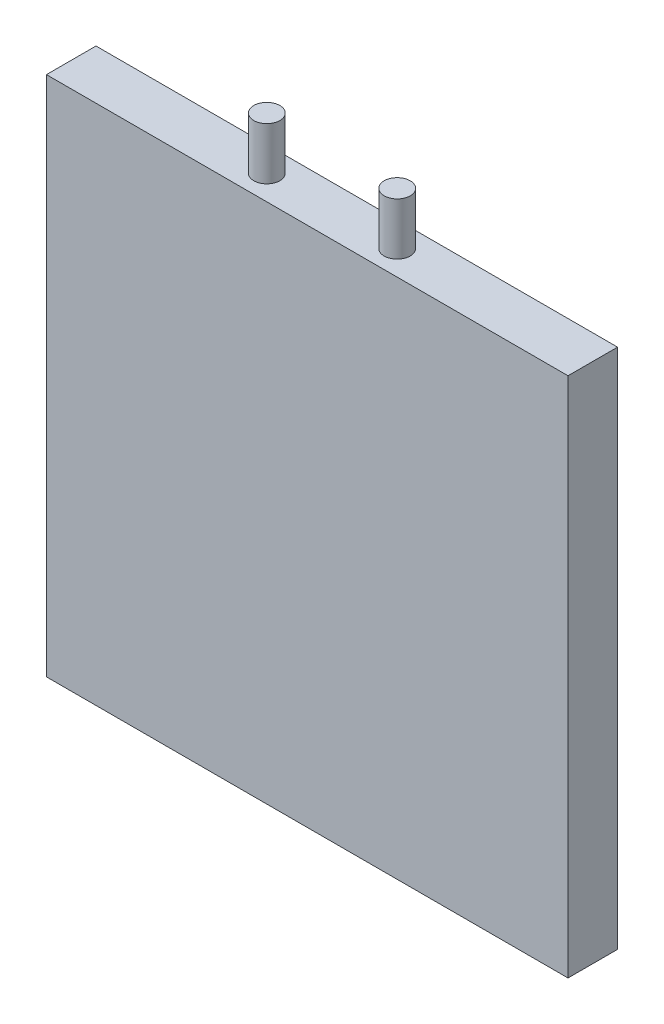
ISO-10303-21;
HEADER;
FILE_DESCRIPTION(('STEP AP214'),'2;1');
FILE_NAME('part.step','',(''),(''),'','','');
FILE_SCHEMA(('AUTOMOTIVE_DESIGN { 1 0 10303 214 1 1 1 1 }'));
ENDSEC;
DATA;
#1=APPLICATION_CONTEXT('core data for automotive mechanical design processes');
#2=APPLICATION_PROTOCOL_DEFINITION('international standard','automotive_design',2000,#1);
#3=PRODUCT_CONTEXT('',#1,'mechanical');
#4=PRODUCT('Part','Part','',(#3));
#5=PRODUCT_RELATED_PRODUCT_CATEGORY('part','',(#4));
#6=PRODUCT_DEFINITION_FORMATION('','',#4);
#7=PRODUCT_DEFINITION_CONTEXT('part definition',#1,'design');
#8=PRODUCT_DEFINITION('design','',#6,#7);
#9=PRODUCT_DEFINITION_SHAPE('','',#8);
#10=(LENGTH_UNIT() NAMED_UNIT(*) SI_UNIT(.MILLI.,.METRE.));
#11=(NAMED_UNIT(*) PLANE_ANGLE_UNIT() SI_UNIT($,.RADIAN.));
#12=(NAMED_UNIT(*) SI_UNIT($,.STERADIAN.) SOLID_ANGLE_UNIT());
#13=UNCERTAINTY_MEASURE_WITH_UNIT(LENGTH_MEASURE(1.E-05),#10,'distance_accuracy_value','');
#14=(GEOMETRIC_REPRESENTATION_CONTEXT(3) GLOBAL_UNCERTAINTY_ASSIGNED_CONTEXT((#13)) GLOBAL_UNIT_ASSIGNED_CONTEXT((#10,
#11,#12)) REPRESENTATION_CONTEXT('',''));
#15=CARTESIAN_POINT('',(0.,0.,0.));
#16=DIRECTION('',(0.,0.,1.));
#17=DIRECTION('',(1.,0.,0.));
#18=AXIS2_PLACEMENT_3D('',#15,#16,#17);
#19=CARTESIAN_POINT('',(-20.,20.,3.8));
#20=DIRECTION('',(0.,-1.,0.));
#21=DIRECTION('',(0.,0.,-1.));
#22=AXIS2_PLACEMENT_3D('',#19,#20,#21);
#23=PLANE('',#22);
#24=CARTESIAN_POINT('',(5.,20.,1.9));
#25=DIRECTION('',(0.,-1.,0.));
#26=DIRECTION('',(0.,0.,-1.));
#27=AXIS2_PLACEMENT_3D('',#24,#25,#26);
#28=CIRCLE('',#27,1.);
#29=CARTESIAN_POINT('',(5.,20.,0.899999999999998));
#30=VERTEX_POINT('',#29);
#31=EDGE_CURVE('E46',#30,#30,#28,.F.);
#32=ORIENTED_EDGE('',*,*,#31,.F.);
#33=EDGE_LOOP('',(#32));
#34=FACE_BOUND('',#33,.T.);
#35=DIRECTION('',(-1.,0.,0.));
#36=VECTOR('',#35,1.);
#37=CARTESIAN_POINT('',(-20.,20.,0.));
#38=LINE('',#37,#36);
#39=CARTESIAN_POINT('',(20.,20.,0.));
#40=VERTEX_POINT('',#39);
#41=CARTESIAN_POINT('',(-20.,20.,0.));
#42=VERTEX_POINT('',#41);
#43=EDGE_CURVE('E95',#40,#42,#38,.T.);
#44=ORIENTED_EDGE('',*,*,#43,.T.);
#45=DIRECTION('',(0.,0.,-1.));
#46=VECTOR('',#45,1.);
#47=CARTESIAN_POINT('',(-20.,20.,3.8));
#48=LINE('',#47,#46);
#49=CARTESIAN_POINT('',(-20.,20.,3.8));
#50=VERTEX_POINT('',#49);
#51=EDGE_CURVE('E93',#50,#42,#48,.T.);
#52=ORIENTED_EDGE('',*,*,#51,.F.);
#53=DIRECTION('',(-1.,0.,0.));
#54=VECTOR('',#53,1.);
#55=CARTESIAN_POINT('',(-20.,20.,3.8));
#56=LINE('',#55,#54);
#57=CARTESIAN_POINT('',(20.,20.,3.8));
#58=VERTEX_POINT('',#57);
#59=EDGE_CURVE('E85',#58,#50,#56,.T.);
#60=ORIENTED_EDGE('',*,*,#59,.F.);
#61=DIRECTION('',(0.,0.,-1.));
#62=VECTOR('',#61,1.);
#63=CARTESIAN_POINT('',(20.,20.,3.8));
#64=LINE('',#63,#62);
#65=EDGE_CURVE('E96',#58,#40,#64,.T.);
#66=ORIENTED_EDGE('',*,*,#65,.T.);
#67=EDGE_LOOP('',(#44,#52,#60,#66));
#68=FACE_BOUND('',#67,.T.);
#69=CARTESIAN_POINT('',(-5.,20.,1.9));
#70=DIRECTION('',(0.,-1.,0.));
#71=DIRECTION('',(0.,0.,-1.));
#72=AXIS2_PLACEMENT_3D('',#69,#70,#71);
#73=CIRCLE('',#72,1.);
#74=CARTESIAN_POINT('',(-5.,20.,0.899999999999998));
#75=VERTEX_POINT('',#74);
#76=EDGE_CURVE('E11',#75,#75,#73,.F.);
#77=ORIENTED_EDGE('',*,*,#76,.F.);
#78=EDGE_LOOP('',(#77));
#79=FACE_BOUND('',#78,.T.);
#80=ADVANCED_FACE('F37',(#34,#68,#79),#23,.F.);
#81=CARTESIAN_POINT('',(20.,20.,3.8));
#82=DIRECTION('',(-1.,0.,0.));
#83=DIRECTION('',(0.,-1.,0.));
#84=AXIS2_PLACEMENT_3D('',#81,#82,#83);
#85=PLANE('',#84);
#86=DIRECTION('',(0.,1.,0.));
#87=VECTOR('',#86,1.);
#88=CARTESIAN_POINT('',(20.,20.,0.));
#89=LINE('',#88,#87);
#90=CARTESIAN_POINT('',(20.,-20.,0.));
#91=VERTEX_POINT('',#90);
#92=EDGE_CURVE('E105',#91,#40,#89,.T.);
#93=ORIENTED_EDGE('',*,*,#92,.T.);
#94=ORIENTED_EDGE('',*,*,#65,.F.);
#95=DIRECTION('',(0.,1.,0.));
#96=VECTOR('',#95,1.);
#97=CARTESIAN_POINT('',(20.,20.,3.8));
#98=LINE('',#97,#96);
#99=CARTESIAN_POINT('',(20.,-20.,3.8));
#100=VERTEX_POINT('',#99);
#101=EDGE_CURVE('E90',#100,#58,#98,.T.);
#102=ORIENTED_EDGE('',*,*,#101,.F.);
#103=DIRECTION('',(0.,0.,-1.));
#104=VECTOR('',#103,1.);
#105=CARTESIAN_POINT('',(20.,-20.,3.8));
#106=LINE('',#105,#104);
#107=EDGE_CURVE('E101',#100,#91,#106,.T.);
#108=ORIENTED_EDGE('',*,*,#107,.T.);
#109=EDGE_LOOP('',(#93,#94,#102,#108));
#110=FACE_BOUND('',#109,.T.);
#111=ADVANCED_FACE('F39',(#110),#85,.F.);
#112=CARTESIAN_POINT('',(-20.,20.,3.8));
#113=DIRECTION('',(1.,0.,0.));
#114=DIRECTION('',(0.,1.,0.));
#115=AXIS2_PLACEMENT_3D('',#112,#113,#114);
#116=PLANE('',#115);
#117=DIRECTION('',(0.,-1.,0.));
#118=VECTOR('',#117,1.);
#119=CARTESIAN_POINT('',(-20.,20.,0.));
#120=LINE('',#119,#118);
#121=CARTESIAN_POINT('',(-20.,-20.,0.));
#122=VERTEX_POINT('',#121);
#123=EDGE_CURVE('E71',#42,#122,#120,.T.);
#124=ORIENTED_EDGE('',*,*,#123,.T.);
#125=DIRECTION('',(0.,0.,-1.));
#126=VECTOR('',#125,1.);
#127=CARTESIAN_POINT('',(-20.,-20.,3.8));
#128=LINE('',#127,#126);
#129=CARTESIAN_POINT('',(-20.,-20.,3.8));
#130=VERTEX_POINT('',#129);
#131=EDGE_CURVE('E97',#130,#122,#128,.T.);
#132=ORIENTED_EDGE('',*,*,#131,.F.);
#133=DIRECTION('',(0.,-1.,0.));
#134=VECTOR('',#133,1.);
#135=CARTESIAN_POINT('',(-20.,20.,3.8));
#136=LINE('',#135,#134);
#137=EDGE_CURVE('E88',#50,#130,#136,.T.);
#138=ORIENTED_EDGE('',*,*,#137,.F.);
#139=ORIENTED_EDGE('',*,*,#51,.T.);
#140=EDGE_LOOP('',(#124,#132,#138,#139));
#141=FACE_BOUND('',#140,.T.);
#142=ADVANCED_FACE('F99',(#141),#116,.F.);
#143=CARTESIAN_POINT('',(-20.,-20.,3.8));
#144=DIRECTION('',(0.,1.,0.));
#145=DIRECTION('',(0.,0.,1.));
#146=AXIS2_PLACEMENT_3D('',#143,#144,#145);
#147=PLANE('',#146);
#148=DIRECTION('',(1.,0.,0.));
#149=VECTOR('',#148,1.);
#150=CARTESIAN_POINT('',(-20.,-20.,0.));
#151=LINE('',#150,#149);
#152=EDGE_CURVE('E77',#122,#91,#151,.T.);
#153=ORIENTED_EDGE('',*,*,#152,.T.);
#154=ORIENTED_EDGE('',*,*,#107,.F.);
#155=DIRECTION('',(1.,0.,0.));
#156=VECTOR('',#155,1.);
#157=CARTESIAN_POINT('',(-20.,-20.,3.8));
#158=LINE('',#157,#156);
#159=EDGE_CURVE('E54',#130,#100,#158,.T.);
#160=ORIENTED_EDGE('',*,*,#159,.F.);
#161=ORIENTED_EDGE('',*,*,#131,.T.);
#162=EDGE_LOOP('',(#153,#154,#160,#161));
#163=FACE_BOUND('',#162,.T.);
#164=ADVANCED_FACE('F127',(#163),#147,.F.);
#165=CARTESIAN_POINT('',(0.,0.,3.8));
#166=DIRECTION('',(0.,0.,1.));
#167=DIRECTION('',(1.,0.,0.));
#168=AXIS2_PLACEMENT_3D('',#165,#166,#167);
#169=PLANE('',#168);
#170=ORIENTED_EDGE('',*,*,#101,.T.);
#171=ORIENTED_EDGE('',*,*,#59,.T.);
#172=ORIENTED_EDGE('',*,*,#137,.T.);
#173=ORIENTED_EDGE('',*,*,#159,.T.);
#174=EDGE_LOOP('',(#170,#171,#172,#173));
#175=FACE_BOUND('',#174,.T.);
#176=ADVANCED_FACE('F86',(#175),#169,.T.);
#177=CARTESIAN_POINT('',(0.,0.,0.));
#178=DIRECTION('',(0.,0.,1.));
#179=DIRECTION('',(1.,0.,0.));
#180=AXIS2_PLACEMENT_3D('',#177,#178,#179);
#181=PLANE('',#180);
#182=ORIENTED_EDGE('',*,*,#92,.F.);
#183=ORIENTED_EDGE('',*,*,#152,.F.);
#184=ORIENTED_EDGE('',*,*,#123,.F.);
#185=ORIENTED_EDGE('',*,*,#43,.F.);
#186=EDGE_LOOP('',(#182,#183,#184,#185));
#187=FACE_BOUND('',#186,.T.);
#188=ADVANCED_FACE('F130',(#187),#181,.F.);
#189=CARTESIAN_POINT('',(5.,24.,1.9));
#190=DIRECTION('',(0.,-1.,0.));
#191=DIRECTION('',(0.,0.,-1.));
#192=AXIS2_PLACEMENT_3D('',#189,#190,#191);
#193=CYLINDRICAL_SURFACE('',#192,1.);
#194=CARTESIAN_POINT('',(5.,24.,1.9));
#195=DIRECTION('',(0.,1.,0.));
#196=DIRECTION('',(0.,0.,1.));
#197=AXIS2_PLACEMENT_3D('',#194,#195,#196);
#198=CIRCLE('',#197,1.);
#199=CARTESIAN_POINT('',(5.,24.,2.9));
#200=VERTEX_POINT('',#199);
#201=EDGE_CURVE('E108',#200,#200,#198,.T.);
#202=ORIENTED_EDGE('',*,*,#201,.F.);
#203=EDGE_LOOP('',(#202));
#204=FACE_BOUND('',#203,.T.);
#205=ORIENTED_EDGE('',*,*,#31,.T.);
#206=EDGE_LOOP('',(#205));
#207=FACE_BOUND('',#206,.T.);
#208=ADVANCED_FACE('F117',(#204,#207),#193,.T.);
#209=CARTESIAN_POINT('',(5.,24.,1.9));
#210=DIRECTION('',(0.,1.,0.));
#211=DIRECTION('',(0.,0.,1.));
#212=AXIS2_PLACEMENT_3D('',#209,#210,#211);
#213=PLANE('',#212);
#214=ORIENTED_EDGE('',*,*,#201,.T.);
#215=EDGE_LOOP('',(#214));
#216=FACE_BOUND('',#215,.T.);
#217=ADVANCED_FACE('F138',(#216),#213,.T.);
#218=CARTESIAN_POINT('',(-5.,24.,1.9));
#219=DIRECTION('',(0.,-1.,0.));
#220=DIRECTION('',(0.,0.,-1.));
#221=AXIS2_PLACEMENT_3D('',#218,#219,#220);
#222=CYLINDRICAL_SURFACE('',#221,1.);
#223=CARTESIAN_POINT('',(-5.,24.,1.9));
#224=DIRECTION('',(0.,1.,0.));
#225=DIRECTION('',(0.,0.,1.));
#226=AXIS2_PLACEMENT_3D('',#223,#224,#225);
#227=CIRCLE('',#226,1.);
#228=CARTESIAN_POINT('',(-5.,24.,2.9));
#229=VERTEX_POINT('',#228);
#230=EDGE_CURVE('E154',#229,#229,#227,.T.);
#231=ORIENTED_EDGE('',*,*,#230,.F.);
#232=EDGE_LOOP('',(#231));
#233=FACE_BOUND('',#232,.T.);
#234=ORIENTED_EDGE('',*,*,#76,.T.);
#235=EDGE_LOOP('',(#234));
#236=FACE_BOUND('',#235,.T.);
#237=ADVANCED_FACE('F142',(#233,#236),#222,.T.);
#238=CARTESIAN_POINT('',(-5.,24.,1.9));
#239=DIRECTION('',(0.,1.,0.));
#240=DIRECTION('',(0.,0.,1.));
#241=AXIS2_PLACEMENT_3D('',#238,#239,#240);
#242=PLANE('',#241);
#243=ORIENTED_EDGE('',*,*,#230,.T.);
#244=EDGE_LOOP('',(#243));
#245=FACE_BOUND('',#244,.T.);
#246=ADVANCED_FACE('F146',(#245),#242,.T.);
#247=CLOSED_SHELL('',(#80,#111,#142,#164,#176,#188,#208,#217,#237,#246));
#248=MANIFOLD_SOLID_BREP('B2',#247);
#249=ADVANCED_BREP_SHAPE_REPRESENTATION('',(#18,#248),#14);
#250=SHAPE_DEFINITION_REPRESENTATION(#9,#249);
ENDSEC;
END-ISO-10303-21;
